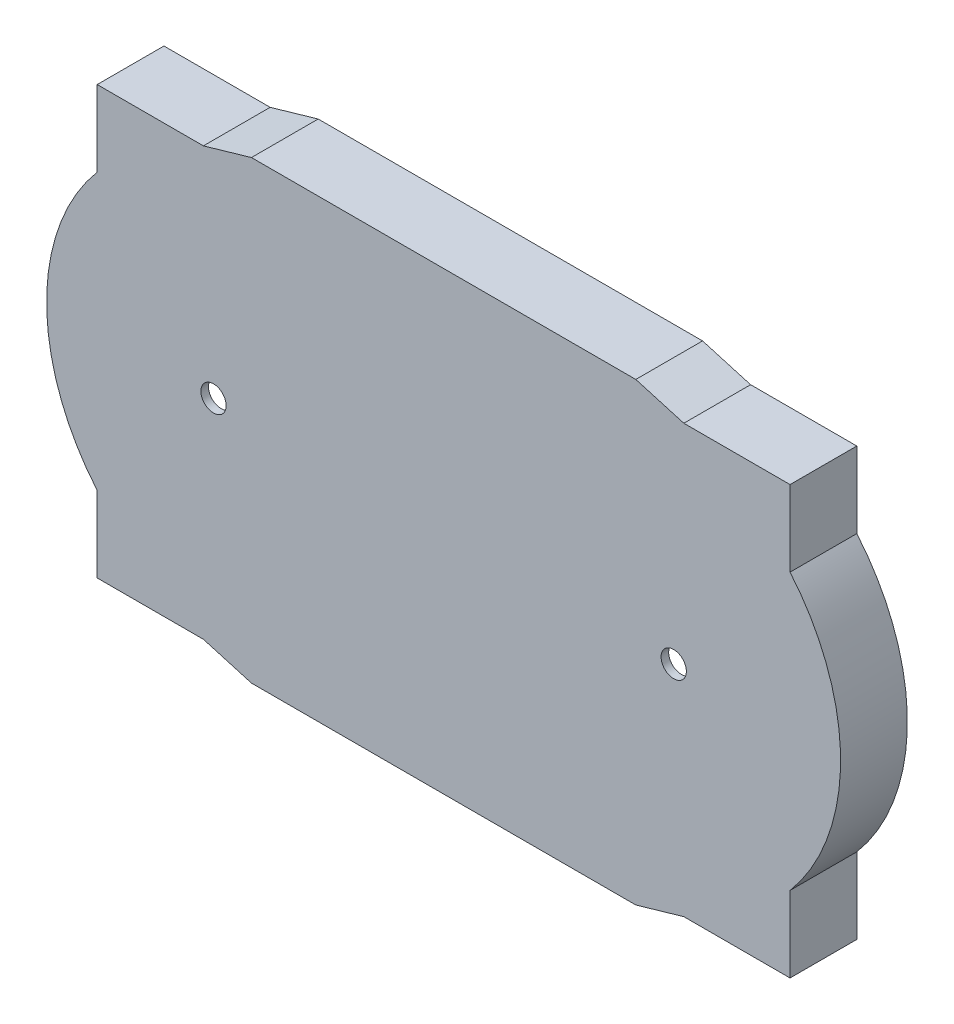
ISO-10303-21;
HEADER;
FILE_DESCRIPTION(('STEP AP214'),'2;1');
FILE_NAME('part.step','',(''),(''),'','','');
FILE_SCHEMA(('AUTOMOTIVE_DESIGN { 1 0 10303 214 1 1 1 1 }'));
ENDSEC;
DATA;
#1=APPLICATION_CONTEXT('core data for automotive mechanical design processes');
#2=APPLICATION_PROTOCOL_DEFINITION('international standard','automotive_design',2000,#1);
#3=PRODUCT_CONTEXT('',#1,'mechanical');
#4=PRODUCT('Part','Part','',(#3));
#5=PRODUCT_RELATED_PRODUCT_CATEGORY('part','',(#4));
#6=PRODUCT_DEFINITION_FORMATION('','',#4);
#7=PRODUCT_DEFINITION_CONTEXT('part definition',#1,'design');
#8=PRODUCT_DEFINITION('design','',#6,#7);
#9=PRODUCT_DEFINITION_SHAPE('','',#8);
#10=(LENGTH_UNIT() NAMED_UNIT(*) SI_UNIT(.MILLI.,.METRE.));
#11=(NAMED_UNIT(*) PLANE_ANGLE_UNIT() SI_UNIT($,.RADIAN.));
#12=(NAMED_UNIT(*) SI_UNIT($,.STERADIAN.) SOLID_ANGLE_UNIT());
#13=UNCERTAINTY_MEASURE_WITH_UNIT(LENGTH_MEASURE(1.E-05),#10,'distance_accuracy_value','');
#14=(GEOMETRIC_REPRESENTATION_CONTEXT(3) GLOBAL_UNCERTAINTY_ASSIGNED_CONTEXT((#13)) GLOBAL_UNIT_ASSIGNED_CONTEXT((#10,
#11,#12)) REPRESENTATION_CONTEXT('',''));
#15=CARTESIAN_POINT('',(0.,0.,0.));
#16=DIRECTION('',(0.,0.,1.));
#17=DIRECTION('',(1.,0.,0.));
#18=AXIS2_PLACEMENT_3D('',#15,#16,#17);
#19=CARTESIAN_POINT('',(0.,0.,0.));
#20=DIRECTION('',(0.,0.,1.));
#21=DIRECTION('',(1.,0.,0.));
#22=AXIS2_PLACEMENT_3D('',#19,#20,#21);
#23=PLANE('',#22);
#24=DIRECTION('',(1.,0.,0.));
#25=VECTOR('',#24,1.);
#26=CARTESIAN_POINT('',(47.5,42.25,0.));
#27=LINE('',#26,#25);
#28=CARTESIAN_POINT('',(47.5,42.25,0.));
#29=VERTEX_POINT('',#28);
#30=CARTESIAN_POINT('',(68.5,42.25,0.));
#31=VERTEX_POINT('',#30);
#32=EDGE_CURVE('E467',#29,#31,#27,.T.);
#33=ORIENTED_EDGE('',*,*,#32,.T.);
#34=DIRECTION('',(0.,-1.,0.));
#35=VECTOR('',#34,1.);
#36=CARTESIAN_POINT('',(68.5,42.25,0.));
#37=LINE('',#36,#35);
#38=CARTESIAN_POINT('',(68.5,27.25,0.));
#39=VERTEX_POINT('',#38);
#40=EDGE_CURVE('E389',#31,#39,#37,.T.);
#41=ORIENTED_EDGE('',*,*,#40,.T.);
#42=CARTESIAN_POINT('',(36.3676618161815,0.,0.));
#43=DIRECTION('',(0.,0.,-1.));
#44=DIRECTION('',(-1.,0.,0.));
#45=AXIS2_PLACEMENT_3D('',#42,#43,#44);
#46=CIRCLE('',#45,42.1313381838184);
#47=CARTESIAN_POINT('',(68.5,-27.25,0.));
#48=VERTEX_POINT('',#47);
#49=EDGE_CURVE('E382',#39,#48,#46,.T.);
#50=ORIENTED_EDGE('',*,*,#49,.T.);
#51=DIRECTION('',(0.,-1.,0.));
#52=VECTOR('',#51,1.);
#53=CARTESIAN_POINT('',(68.5,-42.25,0.));
#54=LINE('',#53,#52);
#55=CARTESIAN_POINT('',(68.5,-42.25,0.));
#56=VERTEX_POINT('',#55);
#57=EDGE_CURVE('E385',#48,#56,#54,.T.);
#58=ORIENTED_EDGE('',*,*,#57,.T.);
#59=DIRECTION('',(-1.,0.,0.));
#60=VECTOR('',#59,1.);
#61=CARTESIAN_POINT('',(47.5,-42.25,0.));
#62=LINE('',#61,#60);
#63=CARTESIAN_POINT('',(47.5,-42.25,0.));
#64=VERTEX_POINT('',#63);
#65=EDGE_CURVE('E448',#56,#64,#62,.T.);
#66=ORIENTED_EDGE('',*,*,#65,.T.);
#67=DIRECTION('',(-0.960564264414561,-0.27805807654106,0.));
#68=VECTOR('',#67,1.);
#69=CARTESIAN_POINT('',(38.,-45.,0.));
#70=LINE('',#69,#68);
#71=CARTESIAN_POINT('',(38.,-45.,0.));
#72=VERTEX_POINT('',#71);
#73=EDGE_CURVE('E450',#64,#72,#70,.T.);
#74=ORIENTED_EDGE('',*,*,#73,.T.);
#75=DIRECTION('',(1.,0.,0.));
#76=VECTOR('',#75,1.);
#77=CARTESIAN_POINT('',(-78.5,-45.,0.));
#78=LINE('',#77,#76);
#79=CARTESIAN_POINT('',(-38.,-45.,0.));
#80=VERTEX_POINT('',#79);
#81=EDGE_CURVE('E493',#80,#72,#78,.T.);
#82=ORIENTED_EDGE('',*,*,#81,.F.);
#83=DIRECTION('',(-0.960564264414561,0.27805807654106,0.));
#84=VECTOR('',#83,1.);
#85=CARTESIAN_POINT('',(-38.,-45.,0.));
#86=LINE('',#85,#84);
#87=CARTESIAN_POINT('',(-47.5,-42.25,0.));
#88=VERTEX_POINT('',#87);
#89=EDGE_CURVE('E432',#80,#88,#86,.T.);
#90=ORIENTED_EDGE('',*,*,#89,.T.);
#91=DIRECTION('',(-1.,0.,0.));
#92=VECTOR('',#91,1.);
#93=CARTESIAN_POINT('',(-47.5,-42.25,0.));
#94=LINE('',#93,#92);
#95=CARTESIAN_POINT('',(-68.5,-42.25,0.));
#96=VERTEX_POINT('',#95);
#97=EDGE_CURVE('E435',#88,#96,#94,.T.);
#98=ORIENTED_EDGE('',*,*,#97,.T.);
#99=DIRECTION('',(0.,1.,0.));
#100=VECTOR('',#99,1.);
#101=CARTESIAN_POINT('',(-68.5,-42.25,0.));
#102=LINE('',#101,#100);
#103=CARTESIAN_POINT('',(-68.5,-27.25,0.));
#104=VERTEX_POINT('',#103);
#105=EDGE_CURVE('E406',#96,#104,#102,.T.);
#106=ORIENTED_EDGE('',*,*,#105,.T.);
#107=CARTESIAN_POINT('',(-36.3676618161815,0.,0.));
#108=DIRECTION('',(0.,0.,-1.));
#109=DIRECTION('',(1.,0.,0.));
#110=AXIS2_PLACEMENT_3D('',#107,#108,#109);
#111=CIRCLE('',#110,42.1313381838184);
#112=CARTESIAN_POINT('',(-68.5,27.25,0.));
#113=VERTEX_POINT('',#112);
#114=EDGE_CURVE('E409',#104,#113,#111,.T.);
#115=ORIENTED_EDGE('',*,*,#114,.T.);
#116=DIRECTION('',(0.,1.,0.));
#117=VECTOR('',#116,1.);
#118=CARTESIAN_POINT('',(-68.5,42.25,0.));
#119=LINE('',#118,#117);
#120=CARTESIAN_POINT('',(-68.5,42.25,0.));
#121=VERTEX_POINT('',#120);
#122=EDGE_CURVE('E413',#113,#121,#119,.T.);
#123=ORIENTED_EDGE('',*,*,#122,.T.);
#124=DIRECTION('',(1.,0.,0.));
#125=VECTOR('',#124,1.);
#126=CARTESIAN_POINT('',(-47.5,42.25,0.));
#127=LINE('',#126,#125);
#128=CARTESIAN_POINT('',(-47.5,42.25,0.));
#129=VERTEX_POINT('',#128);
#130=EDGE_CURVE('E480',#121,#129,#127,.T.);
#131=ORIENTED_EDGE('',*,*,#130,.T.);
#132=DIRECTION('',(0.960564264414561,0.27805807654106,0.));
#133=VECTOR('',#132,1.);
#134=CARTESIAN_POINT('',(-38.,45.,0.));
#135=LINE('',#134,#133);
#136=CARTESIAN_POINT('',(-38.,45.,0.));
#137=VERTEX_POINT('',#136);
#138=EDGE_CURVE('E482',#129,#137,#135,.T.);
#139=ORIENTED_EDGE('',*,*,#138,.T.);
#140=DIRECTION('',(-1.,0.,0.));
#141=VECTOR('',#140,1.);
#142=CARTESIAN_POINT('',(-78.5,45.,0.));
#143=LINE('',#142,#141);
#144=CARTESIAN_POINT('',(38.,45.,0.));
#145=VERTEX_POINT('',#144);
#146=EDGE_CURVE('E496',#145,#137,#143,.T.);
#147=ORIENTED_EDGE('',*,*,#146,.F.);
#148=DIRECTION('',(0.960564264414561,-0.27805807654106,0.));
#149=VECTOR('',#148,1.);
#150=CARTESIAN_POINT('',(38.,45.,0.));
#151=LINE('',#150,#149);
#152=EDGE_CURVE('E464',#145,#29,#151,.T.);
#153=ORIENTED_EDGE('',*,*,#152,.T.);
#154=EDGE_LOOP('',(#33,#41,#50,#58,#66,#74,#82,#90,#98,#106,#115,#123,#131,#139,#147,#153));
#155=FACE_BOUND('',#154,.T.);
#156=DIRECTION('',(1.,0.,0.));
#157=VECTOR('',#156,1.);
#158=CARTESIAN_POINT('',(0.,40.75,0.));
#159=LINE('',#158,#157);
#160=CARTESIAN_POINT('',(47.2872616968584,40.75,0.));
#161=VERTEX_POINT('',#160);
#162=CARTESIAN_POINT('',(67.,40.75,0.));
#163=VERTEX_POINT('',#162);
#164=EDGE_CURVE('E323',#161,#163,#159,.T.);
#165=ORIENTED_EDGE('',*,*,#164,.F.);
#166=DIRECTION('',(0.960564264414561,-0.27805807654106,0.));
#167=VECTOR('',#166,1.);
#168=CARTESIAN_POINT('',(14.5401013835912,50.2294411433143,0.));
#169=LINE('',#168,#167);
#170=CARTESIAN_POINT('',(37.7872616968585,43.5,0.));
#171=VERTEX_POINT('',#170);
#172=EDGE_CURVE('E286',#171,#161,#169,.T.);
#173=ORIENTED_EDGE('',*,*,#172,.F.);
#174=DIRECTION('',(-1.,0.,0.));
#175=VECTOR('',#174,1.);
#176=CARTESIAN_POINT('',(-78.5,43.5,0.));
#177=LINE('',#176,#175);
#178=CARTESIAN_POINT('',(-37.7872616968585,43.5,0.));
#179=VERTEX_POINT('',#178);
#180=EDGE_CURVE('E52',#171,#179,#177,.T.);
#181=ORIENTED_EDGE('',*,*,#180,.T.);
#182=DIRECTION('',(0.960564264414561,0.27805807654106,0.));
#183=VECTOR('',#182,1.);
#184=CARTESIAN_POINT('',(-14.5401013835911,50.2294411433143,0.));
#185=LINE('',#184,#183);
#186=CARTESIAN_POINT('',(-47.2872616968584,40.75,0.));
#187=VERTEX_POINT('',#186);
#188=EDGE_CURVE('E331',#187,#179,#185,.T.);
#189=ORIENTED_EDGE('',*,*,#188,.F.);
#190=DIRECTION('',(1.,0.,0.));
#191=VECTOR('',#190,1.);
#192=CARTESIAN_POINT('',(0.,40.75,0.));
#193=LINE('',#192,#191);
#194=CARTESIAN_POINT('',(-67.,40.75,0.));
#195=VERTEX_POINT('',#194);
#196=EDGE_CURVE('E293',#195,#187,#193,.T.);
#197=ORIENTED_EDGE('',*,*,#196,.F.);
#198=DIRECTION('',(0.,1.,0.));
#199=VECTOR('',#198,1.);
#200=CARTESIAN_POINT('',(-67.,0.,0.));
#201=LINE('',#200,#199);
#202=CARTESIAN_POINT('',(-67.,26.6939225292949,0.));
#203=VERTEX_POINT('',#202);
#204=EDGE_CURVE('E340',#203,#195,#201,.T.);
#205=ORIENTED_EDGE('',*,*,#204,.F.);
#206=CARTESIAN_POINT('',(-36.3676618161815,0.,0.));
#207=DIRECTION('',(0.,0.,1.));
#208=DIRECTION('',(1.,0.,0.));
#209=AXIS2_PLACEMENT_3D('',#206,#207,#208);
#210=CIRCLE('',#209,40.6313381838184);
#211=CARTESIAN_POINT('',(-67.,-26.6939225292949,0.));
#212=VERTEX_POINT('',#211);
#213=EDGE_CURVE('E360',#212,#203,#210,.F.);
#214=ORIENTED_EDGE('',*,*,#213,.F.);
#215=DIRECTION('',(0.,1.,0.));
#216=VECTOR('',#215,1.);
#217=CARTESIAN_POINT('',(-67.,0.,0.));
#218=LINE('',#217,#216);
#219=CARTESIAN_POINT('',(-67.,-40.75,0.));
#220=VERTEX_POINT('',#219);
#221=EDGE_CURVE('E299',#220,#212,#218,.T.);
#222=ORIENTED_EDGE('',*,*,#221,.F.);
#223=DIRECTION('',(-1.,0.,0.));
#224=VECTOR('',#223,1.);
#225=CARTESIAN_POINT('',(0.,-40.75,0.));
#226=LINE('',#225,#224);
#227=CARTESIAN_POINT('',(-47.2872616968584,-40.75,0.));
#228=VERTEX_POINT('',#227);
#229=EDGE_CURVE('E355',#228,#220,#226,.T.);
#230=ORIENTED_EDGE('',*,*,#229,.F.);
#231=DIRECTION('',(-0.960564264414561,0.27805807654106,0.));
#232=VECTOR('',#231,1.);
#233=CARTESIAN_POINT('',(-14.5401013835911,-50.2294411433143,0.));
#234=LINE('',#233,#232);
#235=CARTESIAN_POINT('',(-37.7872616968585,-43.5,0.));
#236=VERTEX_POINT('',#235);
#237=EDGE_CURVE('E310',#236,#228,#234,.T.);
#238=ORIENTED_EDGE('',*,*,#237,.F.);
#239=DIRECTION('',(1.,0.,0.));
#240=VECTOR('',#239,1.);
#241=CARTESIAN_POINT('',(-78.5,-43.5,0.));
#242=LINE('',#241,#240);
#243=CARTESIAN_POINT('',(37.7872616968585,-43.5,0.));
#244=VERTEX_POINT('',#243);
#245=EDGE_CURVE('E327',#236,#244,#242,.T.);
#246=ORIENTED_EDGE('',*,*,#245,.T.);
#247=DIRECTION('',(-0.960564264414561,-0.27805807654106,0.));
#248=VECTOR('',#247,1.);
#249=CARTESIAN_POINT('',(14.5401013835911,-50.2294411433143,0.));
#250=LINE('',#249,#248);
#251=CARTESIAN_POINT('',(47.2872616968584,-40.75,0.));
#252=VERTEX_POINT('',#251);
#253=EDGE_CURVE('E270',#252,#244,#250,.T.);
#254=ORIENTED_EDGE('',*,*,#253,.F.);
#255=DIRECTION('',(-1.,0.,0.));
#256=VECTOR('',#255,1.);
#257=CARTESIAN_POINT('',(0.,-40.75,0.));
#258=LINE('',#257,#256);
#259=CARTESIAN_POINT('',(67.,-40.75,0.));
#260=VERTEX_POINT('',#259);
#261=EDGE_CURVE('E266',#260,#252,#258,.T.);
#262=ORIENTED_EDGE('',*,*,#261,.F.);
#263=DIRECTION('',(0.,-1.,0.));
#264=VECTOR('',#263,1.);
#265=CARTESIAN_POINT('',(67.,0.,0.));
#266=LINE('',#265,#264);
#267=CARTESIAN_POINT('',(67.,-26.6939225292949,0.));
#268=VERTEX_POINT('',#267);
#269=EDGE_CURVE('E375',#268,#260,#266,.T.);
#270=ORIENTED_EDGE('',*,*,#269,.F.);
#271=CARTESIAN_POINT('',(36.3676618161815,0.,0.));
#272=DIRECTION('',(0.,0.,1.));
#273=DIRECTION('',(1.,0.,0.));
#274=AXIS2_PLACEMENT_3D('',#271,#272,#273);
#275=CIRCLE('',#274,40.6313381838184);
#276=CARTESIAN_POINT('',(67.,26.6939225292949,0.));
#277=VERTEX_POINT('',#276);
#278=EDGE_CURVE('E283',#277,#268,#275,.F.);
#279=ORIENTED_EDGE('',*,*,#278,.F.);
#280=DIRECTION('',(0.,-1.,0.));
#281=VECTOR('',#280,1.);
#282=CARTESIAN_POINT('',(67.,0.,0.));
#283=LINE('',#282,#281);
#284=EDGE_CURVE('E349',#163,#277,#283,.T.);
#285=ORIENTED_EDGE('',*,*,#284,.F.);
#286=EDGE_LOOP('',(#165,#173,#181,#189,#197,#205,#214,#222,#230,#238,#246,#254,#262,#270,#279,#285));
#287=FACE_BOUND('',#286,.T.);
#288=ADVANCED_FACE('F35',(#155,#287),#23,.F.);
#289=CARTESIAN_POINT('',(-78.5,-45.,13.2));
#290=DIRECTION('',(0.,1.,0.));
#291=DIRECTION('',(-1.,0.,0.));
#292=AXIS2_PLACEMENT_3D('',#289,#290,#291);
#293=PLANE('',#292);
#294=DIRECTION('',(1.,0.,0.));
#295=VECTOR('',#294,1.);
#296=CARTESIAN_POINT('',(-78.5,-45.,13.2));
#297=LINE('',#296,#295);
#298=CARTESIAN_POINT('',(-38.,-45.,13.2));
#299=VERTEX_POINT('',#298);
#300=CARTESIAN_POINT('',(38.,-45.,13.2));
#301=VERTEX_POINT('',#300);
#302=EDGE_CURVE('E44',#299,#301,#297,.T.);
#303=ORIENTED_EDGE('',*,*,#302,.F.);
#304=DIRECTION('',(0.,0.,1.));
#305=VECTOR('',#304,1.);
#306=CARTESIAN_POINT('',(-38.,-45.,0.));
#307=LINE('',#306,#305);
#308=EDGE_CURVE('E439',#80,#299,#307,.T.);
#309=ORIENTED_EDGE('',*,*,#308,.F.);
#310=ORIENTED_EDGE('',*,*,#81,.T.);
#311=DIRECTION('',(0.,0.,1.));
#312=VECTOR('',#311,1.);
#313=CARTESIAN_POINT('',(38.,-45.,0.));
#314=LINE('',#313,#312);
#315=EDGE_CURVE('E458',#72,#301,#314,.T.);
#316=ORIENTED_EDGE('',*,*,#315,.T.);
#317=EDGE_LOOP('',(#303,#309,#310,#316));
#318=FACE_BOUND('',#317,.T.);
#319=ADVANCED_FACE('F37',(#318),#293,.F.);
#320=CARTESIAN_POINT('',(-78.5,45.,13.2));
#321=DIRECTION('',(0.,-1.,0.));
#322=DIRECTION('',(1.,0.,0.));
#323=AXIS2_PLACEMENT_3D('',#320,#321,#322);
#324=PLANE('',#323);
#325=DIRECTION('',(-1.,0.,0.));
#326=VECTOR('',#325,1.);
#327=CARTESIAN_POINT('',(-78.5,45.,13.2));
#328=LINE('',#327,#326);
#329=CARTESIAN_POINT('',(38.,45.,13.2));
#330=VERTEX_POINT('',#329);
#331=CARTESIAN_POINT('',(-38.,45.,13.2));
#332=VERTEX_POINT('',#331);
#333=EDGE_CURVE('E11',#330,#332,#328,.T.);
#334=ORIENTED_EDGE('',*,*,#333,.F.);
#335=DIRECTION('',(0.,0.,1.));
#336=VECTOR('',#335,1.);
#337=CARTESIAN_POINT('',(38.,45.,0.));
#338=LINE('',#337,#336);
#339=EDGE_CURVE('E471',#145,#330,#338,.T.);
#340=ORIENTED_EDGE('',*,*,#339,.F.);
#341=ORIENTED_EDGE('',*,*,#146,.T.);
#342=DIRECTION('',(0.,0.,1.));
#343=VECTOR('',#342,1.);
#344=CARTESIAN_POINT('',(-38.,45.,0.));
#345=LINE('',#344,#343);
#346=EDGE_CURVE('E490',#137,#332,#345,.T.);
#347=ORIENTED_EDGE('',*,*,#346,.T.);
#348=EDGE_LOOP('',(#334,#340,#341,#347));
#349=FACE_BOUND('',#348,.T.);
#350=ADVANCED_FACE('F540',(#349),#324,.F.);
#351=CARTESIAN_POINT('',(0.,0.,13.2));
#352=DIRECTION('',(0.,0.,1.));
#353=DIRECTION('',(1.,0.,0.));
#354=AXIS2_PLACEMENT_3D('',#351,#352,#353);
#355=PLANE('',#354);
#356=CARTESIAN_POINT('',(-45.5,0.,13.2));
#357=DIRECTION('',(0.,0.,-1.));
#358=DIRECTION('',(1.,0.,0.));
#359=AXIS2_PLACEMENT_3D('',#356,#357,#358);
#360=CIRCLE('',#359,2.5);
#361=CARTESIAN_POINT('',(-43.,0.,13.2));
#362=VERTEX_POINT('',#361);
#363=EDGE_CURVE('E508',#362,#362,#360,.T.);
#364=ORIENTED_EDGE('',*,*,#363,.T.);
#365=EDGE_LOOP('',(#364));
#366=FACE_BOUND('',#365,.T.);
#367=CARTESIAN_POINT('',(45.5,0.,13.2));
#368=DIRECTION('',(0.,0.,-1.));
#369=DIRECTION('',(-1.,0.,0.));
#370=AXIS2_PLACEMENT_3D('',#367,#368,#369);
#371=CIRCLE('',#370,2.5);
#372=CARTESIAN_POINT('',(43.,0.,13.2));
#373=VERTEX_POINT('',#372);
#374=EDGE_CURVE('E500',#373,#373,#371,.T.);
#375=ORIENTED_EDGE('',*,*,#374,.T.);
#376=EDGE_LOOP('',(#375));
#377=FACE_BOUND('',#376,.T.);
#378=DIRECTION('',(0.,-1.,0.));
#379=VECTOR('',#378,1.);
#380=CARTESIAN_POINT('',(68.5,42.25,13.2));
#381=LINE('',#380,#379);
#382=CARTESIAN_POINT('',(68.5,42.25,13.2));
#383=VERTEX_POINT('',#382);
#384=CARTESIAN_POINT('',(68.5,27.25,13.2));
#385=VERTEX_POINT('',#384);
#386=EDGE_CURVE('E386',#383,#385,#381,.T.);
#387=ORIENTED_EDGE('',*,*,#386,.F.);
#388=DIRECTION('',(1.,0.,0.));
#389=VECTOR('',#388,1.);
#390=CARTESIAN_POINT('',(47.5,42.25,13.2));
#391=LINE('',#390,#389);
#392=CARTESIAN_POINT('',(47.5,42.25,13.2));
#393=VERTEX_POINT('',#392);
#394=EDGE_CURVE('E468',#393,#383,#391,.T.);
#395=ORIENTED_EDGE('',*,*,#394,.F.);
#396=DIRECTION('',(0.960564264414561,-0.27805807654106,0.));
#397=VECTOR('',#396,1.);
#398=CARTESIAN_POINT('',(38.,45.,13.2));
#399=LINE('',#398,#397);
#400=EDGE_CURVE('E461',#330,#393,#399,.T.);
#401=ORIENTED_EDGE('',*,*,#400,.F.);
#402=ORIENTED_EDGE('',*,*,#333,.T.);
#403=DIRECTION('',(0.960564264414561,0.27805807654106,0.));
#404=VECTOR('',#403,1.);
#405=CARTESIAN_POINT('',(-38.,45.,13.2));
#406=LINE('',#405,#404);
#407=CARTESIAN_POINT('',(-47.5,42.25,13.2));
#408=VERTEX_POINT('',#407);
#409=EDGE_CURVE('E483',#408,#332,#406,.T.);
#410=ORIENTED_EDGE('',*,*,#409,.F.);
#411=DIRECTION('',(1.,0.,0.));
#412=VECTOR('',#411,1.);
#413=CARTESIAN_POINT('',(-47.5,42.25,13.2));
#414=LINE('',#413,#412);
#415=CARTESIAN_POINT('',(-68.5,42.25,13.2));
#416=VERTEX_POINT('',#415);
#417=EDGE_CURVE('E478',#416,#408,#414,.T.);
#418=ORIENTED_EDGE('',*,*,#417,.F.);
#419=DIRECTION('',(0.,1.,0.));
#420=VECTOR('',#419,1.);
#421=CARTESIAN_POINT('',(-68.5,42.25,13.2));
#422=LINE('',#421,#420);
#423=CARTESIAN_POINT('',(-68.5,27.25,13.2));
#424=VERTEX_POINT('',#423);
#425=EDGE_CURVE('E410',#424,#416,#422,.T.);
#426=ORIENTED_EDGE('',*,*,#425,.F.);
#427=CARTESIAN_POINT('',(-36.3676618161815,0.,13.2));
#428=DIRECTION('',(0.,0.,-1.));
#429=DIRECTION('',(1.,0.,0.));
#430=AXIS2_PLACEMENT_3D('',#427,#428,#429);
#431=CIRCLE('',#430,42.1313381838184);
#432=CARTESIAN_POINT('',(-68.5,-27.25,13.2));
#433=VERTEX_POINT('',#432);
#434=EDGE_CURVE('E419',#433,#424,#431,.T.);
#435=ORIENTED_EDGE('',*,*,#434,.F.);
#436=DIRECTION('',(0.,1.,0.));
#437=VECTOR('',#436,1.);
#438=CARTESIAN_POINT('',(-68.5,-42.25,13.2));
#439=LINE('',#438,#437);
#440=CARTESIAN_POINT('',(-68.5,-42.25,13.2));
#441=VERTEX_POINT('',#440);
#442=EDGE_CURVE('E400',#441,#433,#439,.T.);
#443=ORIENTED_EDGE('',*,*,#442,.F.);
#444=DIRECTION('',(-1.,0.,0.));
#445=VECTOR('',#444,1.);
#446=CARTESIAN_POINT('',(-47.5,-42.25,13.2));
#447=LINE('',#446,#445);
#448=CARTESIAN_POINT('',(-47.5,-42.25,13.2));
#449=VERTEX_POINT('',#448);
#450=EDGE_CURVE('E436',#449,#441,#447,.T.);
#451=ORIENTED_EDGE('',*,*,#450,.F.);
#452=DIRECTION('',(-0.960564264414561,0.27805807654106,0.));
#453=VECTOR('',#452,1.);
#454=CARTESIAN_POINT('',(-38.,-45.,13.2));
#455=LINE('',#454,#453);
#456=EDGE_CURVE('E426',#299,#449,#455,.T.);
#457=ORIENTED_EDGE('',*,*,#456,.F.);
#458=ORIENTED_EDGE('',*,*,#302,.T.);
#459=DIRECTION('',(-0.960564264414561,-0.27805807654106,0.));
#460=VECTOR('',#459,1.);
#461=CARTESIAN_POINT('',(38.,-45.,13.2));
#462=LINE('',#461,#460);
#463=CARTESIAN_POINT('',(47.5,-42.25,13.2));
#464=VERTEX_POINT('',#463);
#465=EDGE_CURVE('E451',#464,#301,#462,.T.);
#466=ORIENTED_EDGE('',*,*,#465,.F.);
#467=DIRECTION('',(-1.,0.,0.));
#468=VECTOR('',#467,1.);
#469=CARTESIAN_POINT('',(47.5,-42.25,13.2));
#470=LINE('',#469,#468);
#471=CARTESIAN_POINT('',(68.5,-42.25,13.2));
#472=VERTEX_POINT('',#471);
#473=EDGE_CURVE('E446',#472,#464,#470,.T.);
#474=ORIENTED_EDGE('',*,*,#473,.F.);
#475=DIRECTION('',(0.,-1.,0.));
#476=VECTOR('',#475,1.);
#477=CARTESIAN_POINT('',(68.5,-42.25,13.2));
#478=LINE('',#477,#476);
#479=CARTESIAN_POINT('',(68.5,-27.25,13.2));
#480=VERTEX_POINT('',#479);
#481=EDGE_CURVE('E60',#480,#472,#478,.T.);
#482=ORIENTED_EDGE('',*,*,#481,.F.);
#483=CARTESIAN_POINT('',(36.3676618161815,0.,13.2));
#484=DIRECTION('',(0.,0.,-1.));
#485=DIRECTION('',(-1.,0.,0.));
#486=AXIS2_PLACEMENT_3D('',#483,#484,#485);
#487=CIRCLE('',#486,42.1313381838184);
#488=EDGE_CURVE('E289',#385,#480,#487,.T.);
#489=ORIENTED_EDGE('',*,*,#488,.F.);
#490=EDGE_LOOP('',(#387,#395,#401,#402,#410,#418,#426,#435,#443,#451,#457,#458,#466,#474,#482,#489));
#491=FACE_BOUND('',#490,.T.);
#492=ADVANCED_FACE('F513',(#366,#377,#491),#355,.T.);
#493=CARTESIAN_POINT('',(-38.,45.,0.));
#494=DIRECTION('',(0.27805807654106,-0.960564264414561,0.));
#495=DIRECTION('',(0.960564264414561,0.27805807654106,0.));
#496=AXIS2_PLACEMENT_3D('',#493,#494,#495);
#497=PLANE('',#496);
#498=ORIENTED_EDGE('',*,*,#409,.T.);
#499=ORIENTED_EDGE('',*,*,#346,.F.);
#500=ORIENTED_EDGE('',*,*,#138,.F.);
#501=DIRECTION('',(0.,0.,1.));
#502=VECTOR('',#501,1.);
#503=CARTESIAN_POINT('',(-47.5,42.25,0.));
#504=LINE('',#503,#502);
#505=EDGE_CURVE('E486',#129,#408,#504,.T.);
#506=ORIENTED_EDGE('',*,*,#505,.T.);
#507=EDGE_LOOP('',(#498,#499,#500,#506));
#508=FACE_BOUND('',#507,.T.);
#509=ADVANCED_FACE('F550',(#508),#497,.F.);
#510=CARTESIAN_POINT('',(-47.5,42.25,0.));
#511=DIRECTION('',(0.,-1.,0.));
#512=DIRECTION('',(1.,0.,0.));
#513=AXIS2_PLACEMENT_3D('',#510,#511,#512);
#514=PLANE('',#513);
#515=ORIENTED_EDGE('',*,*,#130,.F.);
#516=DIRECTION('',(0.,0.,1.));
#517=VECTOR('',#516,1.);
#518=CARTESIAN_POINT('',(-68.5,42.25,0.));
#519=LINE('',#518,#517);
#520=EDGE_CURVE('E423',#121,#416,#519,.T.);
#521=ORIENTED_EDGE('',*,*,#520,.T.);
#522=ORIENTED_EDGE('',*,*,#417,.T.);
#523=ORIENTED_EDGE('',*,*,#505,.F.);
#524=EDGE_LOOP('',(#515,#521,#522,#523));
#525=FACE_BOUND('',#524,.T.);
#526=ADVANCED_FACE('F566',(#525),#514,.F.);
#527=CARTESIAN_POINT('',(47.5,42.25,0.));
#528=DIRECTION('',(0.,-1.,0.));
#529=DIRECTION('',(1.,0.,0.));
#530=AXIS2_PLACEMENT_3D('',#527,#528,#529);
#531=PLANE('',#530);
#532=ORIENTED_EDGE('',*,*,#394,.T.);
#533=DIRECTION('',(0.,0.,1.));
#534=VECTOR('',#533,1.);
#535=CARTESIAN_POINT('',(68.5,42.25,0.));
#536=LINE('',#535,#534);
#537=EDGE_CURVE('E401',#31,#383,#536,.T.);
#538=ORIENTED_EDGE('',*,*,#537,.F.);
#539=ORIENTED_EDGE('',*,*,#32,.F.);
#540=DIRECTION('',(0.,0.,1.));
#541=VECTOR('',#540,1.);
#542=CARTESIAN_POINT('',(47.5,42.25,0.));
#543=LINE('',#542,#541);
#544=EDGE_CURVE('E476',#29,#393,#543,.T.);
#545=ORIENTED_EDGE('',*,*,#544,.T.);
#546=EDGE_LOOP('',(#532,#538,#539,#545));
#547=FACE_BOUND('',#546,.T.);
#548=ADVANCED_FACE('F608',(#547),#531,.F.);
#549=CARTESIAN_POINT('',(38.,45.,0.));
#550=DIRECTION('',(-0.27805807654106,-0.960564264414561,0.));
#551=DIRECTION('',(0.960564264414561,-0.27805807654106,0.));
#552=AXIS2_PLACEMENT_3D('',#549,#550,#551);
#553=PLANE('',#552);
#554=ORIENTED_EDGE('',*,*,#400,.T.);
#555=ORIENTED_EDGE('',*,*,#544,.F.);
#556=ORIENTED_EDGE('',*,*,#152,.F.);
#557=ORIENTED_EDGE('',*,*,#339,.T.);
#558=EDGE_LOOP('',(#554,#555,#556,#557));
#559=FACE_BOUND('',#558,.T.);
#560=ADVANCED_FACE('F611',(#559),#553,.F.);
#561=CARTESIAN_POINT('',(38.,-45.,0.));
#562=DIRECTION('',(-0.27805807654106,0.960564264414561,0.));
#563=DIRECTION('',(-0.960564264414561,-0.27805807654106,0.));
#564=AXIS2_PLACEMENT_3D('',#561,#562,#563);
#565=PLANE('',#564);
#566=ORIENTED_EDGE('',*,*,#465,.T.);
#567=ORIENTED_EDGE('',*,*,#315,.F.);
#568=ORIENTED_EDGE('',*,*,#73,.F.);
#569=DIRECTION('',(0.,0.,1.));
#570=VECTOR('',#569,1.);
#571=CARTESIAN_POINT('',(47.5,-42.25,0.));
#572=LINE('',#571,#570);
#573=EDGE_CURVE('E454',#64,#464,#572,.T.);
#574=ORIENTED_EDGE('',*,*,#573,.T.);
#575=EDGE_LOOP('',(#566,#567,#568,#574));
#576=FACE_BOUND('',#575,.T.);
#577=ADVANCED_FACE('F593',(#576),#565,.F.);
#578=CARTESIAN_POINT('',(47.5,-42.25,0.));
#579=DIRECTION('',(0.,1.,0.));
#580=DIRECTION('',(-1.,0.,0.));
#581=AXIS2_PLACEMENT_3D('',#578,#579,#580);
#582=PLANE('',#581);
#583=ORIENTED_EDGE('',*,*,#65,.F.);
#584=DIRECTION('',(0.,0.,1.));
#585=VECTOR('',#584,1.);
#586=CARTESIAN_POINT('',(68.5,-42.25,0.));
#587=LINE('',#586,#585);
#588=EDGE_CURVE('E403',#56,#472,#587,.T.);
#589=ORIENTED_EDGE('',*,*,#588,.T.);
#590=ORIENTED_EDGE('',*,*,#473,.T.);
#591=ORIENTED_EDGE('',*,*,#573,.F.);
#592=EDGE_LOOP('',(#583,#589,#590,#591));
#593=FACE_BOUND('',#592,.T.);
#594=ADVANCED_FACE('F598',(#593),#582,.F.);
#595=CARTESIAN_POINT('',(-47.5,-42.25,0.));
#596=DIRECTION('',(0.,1.,0.));
#597=DIRECTION('',(-1.,0.,0.));
#598=AXIS2_PLACEMENT_3D('',#595,#596,#597);
#599=PLANE('',#598);
#600=ORIENTED_EDGE('',*,*,#450,.T.);
#601=DIRECTION('',(0.,0.,1.));
#602=VECTOR('',#601,1.);
#603=CARTESIAN_POINT('',(-68.5,-42.25,0.));
#604=LINE('',#603,#602);
#605=EDGE_CURVE('E416',#96,#441,#604,.T.);
#606=ORIENTED_EDGE('',*,*,#605,.F.);
#607=ORIENTED_EDGE('',*,*,#97,.F.);
#608=DIRECTION('',(0.,0.,1.));
#609=VECTOR('',#608,1.);
#610=CARTESIAN_POINT('',(-47.5,-42.25,0.));
#611=LINE('',#610,#609);
#612=EDGE_CURVE('E444',#88,#449,#611,.T.);
#613=ORIENTED_EDGE('',*,*,#612,.T.);
#614=EDGE_LOOP('',(#600,#606,#607,#613));
#615=FACE_BOUND('',#614,.T.);
#616=ADVANCED_FACE('F582',(#615),#599,.F.);
#617=CARTESIAN_POINT('',(-38.,-45.,0.));
#618=DIRECTION('',(0.27805807654106,0.960564264414561,0.));
#619=DIRECTION('',(-0.960564264414561,0.27805807654106,0.));
#620=AXIS2_PLACEMENT_3D('',#617,#618,#619);
#621=PLANE('',#620);
#622=ORIENTED_EDGE('',*,*,#456,.T.);
#623=ORIENTED_EDGE('',*,*,#612,.F.);
#624=ORIENTED_EDGE('',*,*,#89,.F.);
#625=ORIENTED_EDGE('',*,*,#308,.T.);
#626=EDGE_LOOP('',(#622,#623,#624,#625));
#627=FACE_BOUND('',#626,.T.);
#628=ADVANCED_FACE('F585',(#627),#621,.F.);
#629=CARTESIAN_POINT('',(-68.5,42.25,0.));
#630=DIRECTION('',(1.,0.,0.));
#631=DIRECTION('',(0.,0.,-1.));
#632=AXIS2_PLACEMENT_3D('',#629,#630,#631);
#633=PLANE('',#632);
#634=ORIENTED_EDGE('',*,*,#425,.T.);
#635=ORIENTED_EDGE('',*,*,#520,.F.);
#636=ORIENTED_EDGE('',*,*,#122,.F.);
#637=DIRECTION('',(0.,0.,1.));
#638=VECTOR('',#637,1.);
#639=CARTESIAN_POINT('',(-68.5,27.25,0.));
#640=LINE('',#639,#638);
#641=EDGE_CURVE('E427',#113,#424,#640,.T.);
#642=ORIENTED_EDGE('',*,*,#641,.T.);
#643=EDGE_LOOP('',(#634,#635,#636,#642));
#644=FACE_BOUND('',#643,.T.);
#645=ADVANCED_FACE('F571',(#644),#633,.F.);
#646=CARTESIAN_POINT('',(-36.3676618161815,0.,0.));
#647=DIRECTION('',(0.,0.,1.));
#648=DIRECTION('',(1.,0.,0.));
#649=AXIS2_PLACEMENT_3D('',#646,#647,#648);
#650=CYLINDRICAL_SURFACE('',#649,42.1313381838184);
#651=ORIENTED_EDGE('',*,*,#434,.T.);
#652=ORIENTED_EDGE('',*,*,#641,.F.);
#653=ORIENTED_EDGE('',*,*,#114,.F.);
#654=DIRECTION('',(0.,0.,1.));
#655=VECTOR('',#654,1.);
#656=CARTESIAN_POINT('',(-68.5,-27.25,0.));
#657=LINE('',#656,#655);
#658=EDGE_CURVE('E429',#104,#433,#657,.T.);
#659=ORIENTED_EDGE('',*,*,#658,.T.);
#660=EDGE_LOOP('',(#651,#652,#653,#659));
#661=FACE_BOUND('',#660,.T.);
#662=ADVANCED_FACE('F575',(#661),#650,.T.);
#663=CARTESIAN_POINT('',(-68.5,-42.25,0.));
#664=DIRECTION('',(1.,0.,0.));
#665=DIRECTION('',(0.,0.,-1.));
#666=AXIS2_PLACEMENT_3D('',#663,#664,#665);
#667=PLANE('',#666);
#668=ORIENTED_EDGE('',*,*,#442,.T.);
#669=ORIENTED_EDGE('',*,*,#658,.F.);
#670=ORIENTED_EDGE('',*,*,#105,.F.);
#671=ORIENTED_EDGE('',*,*,#605,.T.);
#672=EDGE_LOOP('',(#668,#669,#670,#671));
#673=FACE_BOUND('',#672,.T.);
#674=ADVANCED_FACE('F577',(#673),#667,.F.);
#675=CARTESIAN_POINT('',(36.3676618161815,0.,0.));
#676=DIRECTION('',(0.,0.,1.));
#677=DIRECTION('',(1.,0.,0.));
#678=AXIS2_PLACEMENT_3D('',#675,#676,#677);
#679=CYLINDRICAL_SURFACE('',#678,42.1313381838184);
#680=ORIENTED_EDGE('',*,*,#488,.T.);
#681=DIRECTION('',(0.,0.,1.));
#682=VECTOR('',#681,1.);
#683=CARTESIAN_POINT('',(68.5,-27.25,0.));
#684=LINE('',#683,#682);
#685=EDGE_CURVE('E392',#48,#480,#684,.T.);
#686=ORIENTED_EDGE('',*,*,#685,.F.);
#687=ORIENTED_EDGE('',*,*,#49,.F.);
#688=DIRECTION('',(0.,0.,1.));
#689=VECTOR('',#688,1.);
#690=CARTESIAN_POINT('',(68.5,27.25,0.));
#691=LINE('',#690,#689);
#692=EDGE_CURVE('E398',#39,#385,#691,.T.);
#693=ORIENTED_EDGE('',*,*,#692,.T.);
#694=EDGE_LOOP('',(#680,#686,#687,#693));
#695=FACE_BOUND('',#694,.T.);
#696=ADVANCED_FACE('F602',(#695),#679,.T.);
#697=CARTESIAN_POINT('',(68.5,42.25,0.));
#698=DIRECTION('',(-1.,0.,0.));
#699=DIRECTION('',(0.,0.,1.));
#700=AXIS2_PLACEMENT_3D('',#697,#698,#699);
#701=PLANE('',#700);
#702=ORIENTED_EDGE('',*,*,#386,.T.);
#703=ORIENTED_EDGE('',*,*,#692,.F.);
#704=ORIENTED_EDGE('',*,*,#40,.F.);
#705=ORIENTED_EDGE('',*,*,#537,.T.);
#706=EDGE_LOOP('',(#702,#703,#704,#705));
#707=FACE_BOUND('',#706,.T.);
#708=ADVANCED_FACE('F605',(#707),#701,.F.);
#709=CARTESIAN_POINT('',(68.5,-42.25,0.));
#710=DIRECTION('',(-1.,0.,0.));
#711=DIRECTION('',(0.,0.,1.));
#712=AXIS2_PLACEMENT_3D('',#709,#710,#711);
#713=PLANE('',#712);
#714=ORIENTED_EDGE('',*,*,#481,.T.);
#715=ORIENTED_EDGE('',*,*,#588,.F.);
#716=ORIENTED_EDGE('',*,*,#57,.F.);
#717=ORIENTED_EDGE('',*,*,#685,.T.);
#718=EDGE_LOOP('',(#714,#715,#716,#717));
#719=FACE_BOUND('',#718,.T.);
#720=ADVANCED_FACE('F693',(#719),#713,.F.);
#721=CARTESIAN_POINT('',(-78.5,-43.5,13.2));
#722=DIRECTION('',(0.,1.,0.));
#723=DIRECTION('',(-1.,0.,0.));
#724=AXIS2_PLACEMENT_3D('',#721,#722,#723);
#725=PLANE('',#724);
#726=DIRECTION('',(1.,0.,0.));
#727=VECTOR('',#726,1.);
#728=CARTESIAN_POINT('',(-78.5,-43.5,11.7));
#729=LINE('',#728,#727);
#730=CARTESIAN_POINT('',(-37.7872616968585,-43.5,11.7));
#731=VERTEX_POINT('',#730);
#732=CARTESIAN_POINT('',(37.7872616968585,-43.5,11.7));
#733=VERTEX_POINT('',#732);
#734=EDGE_CURVE('E244',#731,#733,#729,.T.);
#735=ORIENTED_EDGE('',*,*,#734,.T.);
#736=DIRECTION('',(0.,0.,1.));
#737=VECTOR('',#736,1.);
#738=CARTESIAN_POINT('',(37.7872616968585,-43.5,13.2));
#739=LINE('',#738,#737);
#740=EDGE_CURVE('E249',#244,#733,#739,.T.);
#741=ORIENTED_EDGE('',*,*,#740,.F.);
#742=ORIENTED_EDGE('',*,*,#245,.F.);
#743=DIRECTION('',(0.,0.,1.));
#744=VECTOR('',#743,1.);
#745=CARTESIAN_POINT('',(-37.7872616968585,-43.5,0.));
#746=LINE('',#745,#744);
#747=EDGE_CURVE('E251',#236,#731,#746,.T.);
#748=ORIENTED_EDGE('',*,*,#747,.T.);
#749=EDGE_LOOP('',(#735,#741,#742,#748));
#750=FACE_BOUND('',#749,.T.);
#751=ADVANCED_FACE('F246',(#750),#725,.T.);
#752=CARTESIAN_POINT('',(-78.5,43.5,13.2));
#753=DIRECTION('',(0.,-1.,0.));
#754=DIRECTION('',(1.,0.,0.));
#755=AXIS2_PLACEMENT_3D('',#752,#753,#754);
#756=PLANE('',#755);
#757=DIRECTION('',(-1.,0.,0.));
#758=VECTOR('',#757,1.);
#759=CARTESIAN_POINT('',(-78.5,43.5,11.7));
#760=LINE('',#759,#758);
#761=CARTESIAN_POINT('',(37.7872616968585,43.5,11.7));
#762=VERTEX_POINT('',#761);
#763=CARTESIAN_POINT('',(-37.7872616968585,43.5,11.7));
#764=VERTEX_POINT('',#763);
#765=EDGE_CURVE('E255',#762,#764,#760,.T.);
#766=ORIENTED_EDGE('',*,*,#765,.T.);
#767=DIRECTION('',(0.,0.,1.));
#768=VECTOR('',#767,1.);
#769=CARTESIAN_POINT('',(-37.7872616968585,43.5,13.2));
#770=LINE('',#769,#768);
#771=EDGE_CURVE('E324',#179,#764,#770,.T.);
#772=ORIENTED_EDGE('',*,*,#771,.F.);
#773=ORIENTED_EDGE('',*,*,#180,.F.);
#774=DIRECTION('',(0.,0.,1.));
#775=VECTOR('',#774,1.);
#776=CARTESIAN_POINT('',(37.7872616968585,43.5,0.));
#777=LINE('',#776,#775);
#778=EDGE_CURVE('E321',#171,#762,#777,.T.);
#779=ORIENTED_EDGE('',*,*,#778,.T.);
#780=EDGE_LOOP('',(#766,#772,#773,#779));
#781=FACE_BOUND('',#780,.T.);
#782=ADVANCED_FACE('F524',(#781),#756,.T.);
#783=CARTESIAN_POINT('',(0.,0.,11.7));
#784=DIRECTION('',(0.,0.,1.));
#785=DIRECTION('',(1.,0.,0.));
#786=AXIS2_PLACEMENT_3D('',#783,#784,#785);
#787=PLANE('',#786);
#788=CARTESIAN_POINT('',(-45.5,0.,11.7));
#789=DIRECTION('',(0.,0.,1.));
#790=DIRECTION('',(1.,0.,0.));
#791=AXIS2_PLACEMENT_3D('',#788,#789,#790);
#792=CIRCLE('',#791,2.5);
#793=CARTESIAN_POINT('',(-43.,0.,11.7));
#794=VERTEX_POINT('',#793);
#795=EDGE_CURVE('E39',#794,#794,#792,.T.);
#796=ORIENTED_EDGE('',*,*,#795,.T.);
#797=EDGE_LOOP('',(#796));
#798=FACE_BOUND('',#797,.T.);
#799=CARTESIAN_POINT('',(45.5,0.,11.7));
#800=DIRECTION('',(0.,0.,1.));
#801=DIRECTION('',(1.,0.,0.));
#802=AXIS2_PLACEMENT_3D('',#799,#800,#801);
#803=CIRCLE('',#802,2.5);
#804=CARTESIAN_POINT('',(48.,0.,11.7));
#805=VERTEX_POINT('',#804);
#806=EDGE_CURVE('E320',#805,#805,#803,.T.);
#807=ORIENTED_EDGE('',*,*,#806,.T.);
#808=EDGE_LOOP('',(#807));
#809=FACE_BOUND('',#808,.T.);
#810=DIRECTION('',(0.,-1.,0.));
#811=VECTOR('',#810,1.);
#812=CARTESIAN_POINT('',(67.,0.,11.7));
#813=LINE('',#812,#811);
#814=CARTESIAN_POINT('',(67.,40.75,11.7));
#815=VERTEX_POINT('',#814);
#816=CARTESIAN_POINT('',(67.,26.6939225292949,11.7));
#817=VERTEX_POINT('',#816);
#818=EDGE_CURVE('E281',#815,#817,#813,.T.);
#819=ORIENTED_EDGE('',*,*,#818,.T.);
#820=CARTESIAN_POINT('',(36.3676618161815,0.,11.7));
#821=DIRECTION('',(0.,0.,1.));
#822=DIRECTION('',(1.,0.,0.));
#823=AXIS2_PLACEMENT_3D('',#820,#821,#822);
#824=CIRCLE('',#823,40.6313381838184);
#825=CARTESIAN_POINT('',(67.,-26.6939225292949,11.7));
#826=VERTEX_POINT('',#825);
#827=EDGE_CURVE('E317',#817,#826,#824,.F.);
#828=ORIENTED_EDGE('',*,*,#827,.T.);
#829=DIRECTION('',(0.,-1.,0.));
#830=VECTOR('',#829,1.);
#831=CARTESIAN_POINT('',(67.,0.,11.7));
#832=LINE('',#831,#830);
#833=CARTESIAN_POINT('',(67.,-40.75,11.7));
#834=VERTEX_POINT('',#833);
#835=EDGE_CURVE('E284',#826,#834,#832,.T.);
#836=ORIENTED_EDGE('',*,*,#835,.T.);
#837=DIRECTION('',(-1.,0.,0.));
#838=VECTOR('',#837,1.);
#839=CARTESIAN_POINT('',(0.,-40.75,11.7));
#840=LINE('',#839,#838);
#841=CARTESIAN_POINT('',(47.2872616968584,-40.75,11.7));
#842=VERTEX_POINT('',#841);
#843=EDGE_CURVE('E262',#834,#842,#840,.T.);
#844=ORIENTED_EDGE('',*,*,#843,.T.);
#845=DIRECTION('',(-0.960564264414561,-0.27805807654106,0.));
#846=VECTOR('',#845,1.);
#847=CARTESIAN_POINT('',(14.5401013835911,-50.2294411433143,11.7));
#848=LINE('',#847,#846);
#849=EDGE_CURVE('E258',#842,#733,#848,.T.);
#850=ORIENTED_EDGE('',*,*,#849,.T.);
#851=ORIENTED_EDGE('',*,*,#734,.F.);
#852=DIRECTION('',(-0.960564264414561,0.27805807654106,0.));
#853=VECTOR('',#852,1.);
#854=CARTESIAN_POINT('',(-14.5401013835911,-50.2294411433143,11.7));
#855=LINE('',#854,#853);
#856=CARTESIAN_POINT('',(-47.2872616968584,-40.75,11.7));
#857=VERTEX_POINT('',#856);
#858=EDGE_CURVE('E311',#731,#857,#855,.T.);
#859=ORIENTED_EDGE('',*,*,#858,.T.);
#860=DIRECTION('',(-1.,0.,0.));
#861=VECTOR('',#860,1.);
#862=CARTESIAN_POINT('',(0.,-40.75,11.7));
#863=LINE('',#862,#861);
#864=CARTESIAN_POINT('',(-67.,-40.75,11.7));
#865=VERTEX_POINT('',#864);
#866=EDGE_CURVE('E307',#857,#865,#863,.T.);
#867=ORIENTED_EDGE('',*,*,#866,.T.);
#868=DIRECTION('',(0.,1.,0.));
#869=VECTOR('',#868,1.);
#870=CARTESIAN_POINT('',(-67.,0.,11.7));
#871=LINE('',#870,#869);
#872=CARTESIAN_POINT('',(-67.,-26.6939225292949,11.7));
#873=VERTEX_POINT('',#872);
#874=EDGE_CURVE('E303',#865,#873,#871,.T.);
#875=ORIENTED_EDGE('',*,*,#874,.T.);
#876=CARTESIAN_POINT('',(-36.3676618161815,0.,11.7));
#877=DIRECTION('',(0.,0.,1.));
#878=DIRECTION('',(1.,0.,0.));
#879=AXIS2_PLACEMENT_3D('',#876,#877,#878);
#880=CIRCLE('',#879,40.6313381838184);
#881=CARTESIAN_POINT('',(-67.,26.6939225292949,11.7));
#882=VERTEX_POINT('',#881);
#883=EDGE_CURVE('E300',#873,#882,#880,.F.);
#884=ORIENTED_EDGE('',*,*,#883,.T.);
#885=DIRECTION('',(0.,1.,0.));
#886=VECTOR('',#885,1.);
#887=CARTESIAN_POINT('',(-67.,0.,11.7));
#888=LINE('',#887,#886);
#889=CARTESIAN_POINT('',(-67.,40.75,11.7));
#890=VERTEX_POINT('',#889);
#891=EDGE_CURVE('E297',#882,#890,#888,.T.);
#892=ORIENTED_EDGE('',*,*,#891,.T.);
#893=DIRECTION('',(1.,0.,0.));
#894=VECTOR('',#893,1.);
#895=CARTESIAN_POINT('',(0.,40.75,11.7));
#896=LINE('',#895,#894);
#897=CARTESIAN_POINT('',(-47.2872616968584,40.75,11.7));
#898=VERTEX_POINT('',#897);
#899=EDGE_CURVE('E294',#890,#898,#896,.T.);
#900=ORIENTED_EDGE('',*,*,#899,.T.);
#901=DIRECTION('',(0.960564264414561,0.27805807654106,0.));
#902=VECTOR('',#901,1.);
#903=CARTESIAN_POINT('',(-14.5401013835911,50.2294411433143,11.7));
#904=LINE('',#903,#902);
#905=EDGE_CURVE('E290',#898,#764,#904,.T.);
#906=ORIENTED_EDGE('',*,*,#905,.T.);
#907=ORIENTED_EDGE('',*,*,#765,.F.);
#908=DIRECTION('',(0.960564264414561,-0.27805807654106,0.));
#909=VECTOR('',#908,1.);
#910=CARTESIAN_POINT('',(14.5401013835912,50.2294411433143,11.7));
#911=LINE('',#910,#909);
#912=CARTESIAN_POINT('',(47.2872616968584,40.75,11.7));
#913=VERTEX_POINT('',#912);
#914=EDGE_CURVE('E272',#762,#913,#911,.T.);
#915=ORIENTED_EDGE('',*,*,#914,.T.);
#916=DIRECTION('',(1.,0.,0.));
#917=VECTOR('',#916,1.);
#918=CARTESIAN_POINT('',(0.,40.75,11.7));
#919=LINE('',#918,#917);
#920=EDGE_CURVE('E276',#913,#815,#919,.T.);
#921=ORIENTED_EDGE('',*,*,#920,.T.);
#922=EDGE_LOOP('',(#819,#828,#836,#844,#850,#851,#859,#867,#875,#884,#892,#900,#906,#907,#915,#921));
#923=FACE_BOUND('',#922,.T.);
#924=ADVANCED_FACE('F260',(#798,#809,#923),#787,.F.);
#925=CARTESIAN_POINT('',(-37.5829128851884,43.5591536033782,0.));
#926=DIRECTION('',(0.27805807654106,-0.960564264414561,0.));
#927=DIRECTION('',(0.960564264414561,0.27805807654106,0.));
#928=AXIS2_PLACEMENT_3D('',#925,#926,#927);
#929=PLANE('',#928);
#930=ORIENTED_EDGE('',*,*,#905,.F.);
#931=DIRECTION('',(0.,0.,1.));
#932=VECTOR('',#931,1.);
#933=CARTESIAN_POINT('',(-47.2872616968584,40.75,0.));
#934=LINE('',#933,#932);
#935=EDGE_CURVE('E328',#187,#898,#934,.T.);
#936=ORIENTED_EDGE('',*,*,#935,.F.);
#937=ORIENTED_EDGE('',*,*,#188,.T.);
#938=ORIENTED_EDGE('',*,*,#771,.T.);
#939=EDGE_LOOP('',(#930,#936,#937,#938));
#940=FACE_BOUND('',#939,.T.);
#941=ADVANCED_FACE('F523',(#940),#929,.T.);
#942=CARTESIAN_POINT('',(-47.5,40.75,0.));
#943=DIRECTION('',(0.,-1.,0.));
#944=DIRECTION('',(1.,0.,0.));
#945=AXIS2_PLACEMENT_3D('',#942,#943,#944);
#946=PLANE('',#945);
#947=ORIENTED_EDGE('',*,*,#196,.T.);
#948=ORIENTED_EDGE('',*,*,#935,.T.);
#949=ORIENTED_EDGE('',*,*,#899,.F.);
#950=DIRECTION('',(0.,0.,1.));
#951=VECTOR('',#950,1.);
#952=CARTESIAN_POINT('',(-67.,40.75,0.));
#953=LINE('',#952,#951);
#954=EDGE_CURVE('E312',#195,#890,#953,.T.);
#955=ORIENTED_EDGE('',*,*,#954,.F.);
#956=EDGE_LOOP('',(#947,#948,#949,#955));
#957=FACE_BOUND('',#956,.T.);
#958=ADVANCED_FACE('F530',(#957),#946,.T.);
#959=CARTESIAN_POINT('',(47.5,40.75,0.));
#960=DIRECTION('',(0.,-1.,0.));
#961=DIRECTION('',(1.,0.,0.));
#962=AXIS2_PLACEMENT_3D('',#959,#960,#961);
#963=PLANE('',#962);
#964=ORIENTED_EDGE('',*,*,#920,.F.);
#965=DIRECTION('',(0.,0.,1.));
#966=VECTOR('',#965,1.);
#967=CARTESIAN_POINT('',(47.2872616968584,40.75,0.));
#968=LINE('',#967,#966);
#969=EDGE_CURVE('E296',#161,#913,#968,.T.);
#970=ORIENTED_EDGE('',*,*,#969,.F.);
#971=ORIENTED_EDGE('',*,*,#164,.T.);
#972=DIRECTION('',(0.,0.,1.));
#973=VECTOR('',#972,1.);
#974=CARTESIAN_POINT('',(67.,40.75,0.));
#975=LINE('',#974,#973);
#976=EDGE_CURVE('E343',#163,#815,#975,.T.);
#977=ORIENTED_EDGE('',*,*,#976,.T.);
#978=EDGE_LOOP('',(#964,#970,#971,#977));
#979=FACE_BOUND('',#978,.T.);
#980=ADVANCED_FACE('F735',(#979),#963,.T.);
#981=CARTESIAN_POINT('',(37.5829128851884,43.5591536033782,0.));
#982=DIRECTION('',(-0.27805807654106,-0.960564264414561,0.));
#983=DIRECTION('',(0.960564264414561,-0.27805807654106,0.));
#984=AXIS2_PLACEMENT_3D('',#981,#982,#983);
#985=PLANE('',#984);
#986=ORIENTED_EDGE('',*,*,#914,.F.);
#987=ORIENTED_EDGE('',*,*,#778,.F.);
#988=ORIENTED_EDGE('',*,*,#172,.T.);
#989=ORIENTED_EDGE('',*,*,#969,.T.);
#990=EDGE_LOOP('',(#986,#987,#988,#989));
#991=FACE_BOUND('',#990,.T.);
#992=ADVANCED_FACE('F745',(#991),#985,.T.);
#993=CARTESIAN_POINT('',(37.5829128851884,-43.5591536033782,0.));
#994=DIRECTION('',(-0.27805807654106,0.960564264414561,0.));
#995=DIRECTION('',(-0.960564264414561,-0.27805807654106,0.));
#996=AXIS2_PLACEMENT_3D('',#993,#994,#995);
#997=PLANE('',#996);
#998=ORIENTED_EDGE('',*,*,#849,.F.);
#999=DIRECTION('',(0.,0.,1.));
#1000=VECTOR('',#999,1.);
#1001=CARTESIAN_POINT('',(47.2872616968584,-40.75,0.));
#1002=LINE('',#1001,#1000);
#1003=EDGE_CURVE('E273',#252,#842,#1002,.T.);
#1004=ORIENTED_EDGE('',*,*,#1003,.F.);
#1005=ORIENTED_EDGE('',*,*,#253,.T.);
#1006=ORIENTED_EDGE('',*,*,#740,.T.);
#1007=EDGE_LOOP('',(#998,#1004,#1005,#1006));
#1008=FACE_BOUND('',#1007,.T.);
#1009=ADVANCED_FACE('F268',(#1008),#997,.T.);
#1010=CARTESIAN_POINT('',(47.5,-40.75,0.));
#1011=DIRECTION('',(0.,1.,0.));
#1012=DIRECTION('',(-1.,0.,0.));
#1013=AXIS2_PLACEMENT_3D('',#1010,#1011,#1012);
#1014=PLANE('',#1013);
#1015=ORIENTED_EDGE('',*,*,#261,.T.);
#1016=ORIENTED_EDGE('',*,*,#1003,.T.);
#1017=ORIENTED_EDGE('',*,*,#843,.F.);
#1018=DIRECTION('',(0.,0.,1.));
#1019=VECTOR('',#1018,1.);
#1020=CARTESIAN_POINT('',(67.,-40.75,0.));
#1021=LINE('',#1020,#1019);
#1022=EDGE_CURVE('E345',#260,#834,#1021,.T.);
#1023=ORIENTED_EDGE('',*,*,#1022,.F.);
#1024=EDGE_LOOP('',(#1015,#1016,#1017,#1023));
#1025=FACE_BOUND('',#1024,.T.);
#1026=ADVANCED_FACE('F764',(#1025),#1014,.T.);
#1027=CARTESIAN_POINT('',(-47.5,-40.75,0.));
#1028=DIRECTION('',(0.,1.,0.));
#1029=DIRECTION('',(-1.,0.,0.));
#1030=AXIS2_PLACEMENT_3D('',#1027,#1028,#1029);
#1031=PLANE('',#1030);
#1032=ORIENTED_EDGE('',*,*,#866,.F.);
#1033=DIRECTION('',(0.,0.,1.));
#1034=VECTOR('',#1033,1.);
#1035=CARTESIAN_POINT('',(-47.2872616968584,-40.75,0.));
#1036=LINE('',#1035,#1034);
#1037=EDGE_CURVE('E315',#228,#857,#1036,.T.);
#1038=ORIENTED_EDGE('',*,*,#1037,.F.);
#1039=ORIENTED_EDGE('',*,*,#229,.T.);
#1040=DIRECTION('',(0.,0.,1.));
#1041=VECTOR('',#1040,1.);
#1042=CARTESIAN_POINT('',(-67.,-40.75,0.));
#1043=LINE('',#1042,#1041);
#1044=EDGE_CURVE('E338',#220,#865,#1043,.T.);
#1045=ORIENTED_EDGE('',*,*,#1044,.T.);
#1046=EDGE_LOOP('',(#1032,#1038,#1039,#1045));
#1047=FACE_BOUND('',#1046,.T.);
#1048=ADVANCED_FACE('F773',(#1047),#1031,.T.);
#1049=CARTESIAN_POINT('',(-37.5829128851884,-43.5591536033782,0.));
#1050=DIRECTION('',(0.27805807654106,0.960564264414561,0.));
#1051=DIRECTION('',(-0.960564264414561,0.27805807654106,0.));
#1052=AXIS2_PLACEMENT_3D('',#1049,#1050,#1051);
#1053=PLANE('',#1052);
#1054=ORIENTED_EDGE('',*,*,#858,.F.);
#1055=ORIENTED_EDGE('',*,*,#747,.F.);
#1056=ORIENTED_EDGE('',*,*,#237,.T.);
#1057=ORIENTED_EDGE('',*,*,#1037,.T.);
#1058=EDGE_LOOP('',(#1054,#1055,#1056,#1057));
#1059=FACE_BOUND('',#1058,.T.);
#1060=ADVANCED_FACE('F783',(#1059),#1053,.T.);
#1061=CARTESIAN_POINT('',(-67.,42.25,0.));
#1062=DIRECTION('',(1.,0.,0.));
#1063=DIRECTION('',(0.,0.,-1.));
#1064=AXIS2_PLACEMENT_3D('',#1061,#1062,#1063);
#1065=PLANE('',#1064);
#1066=ORIENTED_EDGE('',*,*,#891,.F.);
#1067=DIRECTION('',(0.,0.,1.));
#1068=VECTOR('',#1067,1.);
#1069=CARTESIAN_POINT('',(-67.,26.6939225292949,0.));
#1070=LINE('',#1069,#1068);
#1071=EDGE_CURVE('E334',#203,#882,#1070,.T.);
#1072=ORIENTED_EDGE('',*,*,#1071,.F.);
#1073=ORIENTED_EDGE('',*,*,#204,.T.);
#1074=ORIENTED_EDGE('',*,*,#954,.T.);
#1075=EDGE_LOOP('',(#1066,#1072,#1073,#1074));
#1076=FACE_BOUND('',#1075,.T.);
#1077=ADVANCED_FACE('F793',(#1076),#1065,.T.);
#1078=CARTESIAN_POINT('',(-36.3676618161815,0.,0.));
#1079=DIRECTION('',(0.,0.,1.));
#1080=DIRECTION('',(1.,0.,0.));
#1081=AXIS2_PLACEMENT_3D('',#1078,#1079,#1080);
#1082=CYLINDRICAL_SURFACE('',#1081,40.6313381838184);
#1083=ORIENTED_EDGE('',*,*,#883,.F.);
#1084=DIRECTION('',(0.,0.,1.));
#1085=VECTOR('',#1084,1.);
#1086=CARTESIAN_POINT('',(-67.,-26.6939225292949,0.));
#1087=LINE('',#1086,#1085);
#1088=EDGE_CURVE('E336',#212,#873,#1087,.T.);
#1089=ORIENTED_EDGE('',*,*,#1088,.F.);
#1090=ORIENTED_EDGE('',*,*,#213,.T.);
#1091=ORIENTED_EDGE('',*,*,#1071,.T.);
#1092=EDGE_LOOP('',(#1083,#1089,#1090,#1091));
#1093=FACE_BOUND('',#1092,.T.);
#1094=ADVANCED_FACE('F803',(#1093),#1082,.F.);
#1095=CARTESIAN_POINT('',(-67.,-42.25,0.));
#1096=DIRECTION('',(1.,0.,0.));
#1097=DIRECTION('',(0.,0.,-1.));
#1098=AXIS2_PLACEMENT_3D('',#1095,#1096,#1097);
#1099=PLANE('',#1098);
#1100=ORIENTED_EDGE('',*,*,#874,.F.);
#1101=ORIENTED_EDGE('',*,*,#1044,.F.);
#1102=ORIENTED_EDGE('',*,*,#221,.T.);
#1103=ORIENTED_EDGE('',*,*,#1088,.T.);
#1104=EDGE_LOOP('',(#1100,#1101,#1102,#1103));
#1105=FACE_BOUND('',#1104,.T.);
#1106=ADVANCED_FACE('F813',(#1105),#1099,.T.);
#1107=CARTESIAN_POINT('',(36.3676618161815,0.,0.));
#1108=DIRECTION('',(0.,0.,1.));
#1109=DIRECTION('',(1.,0.,0.));
#1110=AXIS2_PLACEMENT_3D('',#1107,#1108,#1109);
#1111=CYLINDRICAL_SURFACE('',#1110,40.6313381838184);
#1112=ORIENTED_EDGE('',*,*,#827,.F.);
#1113=DIRECTION('',(0.,0.,1.));
#1114=VECTOR('',#1113,1.);
#1115=CARTESIAN_POINT('',(67.,26.6939225292949,0.));
#1116=LINE('',#1115,#1114);
#1117=EDGE_CURVE('E306',#277,#817,#1116,.T.);
#1118=ORIENTED_EDGE('',*,*,#1117,.F.);
#1119=ORIENTED_EDGE('',*,*,#278,.T.);
#1120=DIRECTION('',(0.,0.,1.));
#1121=VECTOR('',#1120,1.);
#1122=CARTESIAN_POINT('',(67.,-26.6939225292949,0.));
#1123=LINE('',#1122,#1121);
#1124=EDGE_CURVE('E347',#268,#826,#1123,.T.);
#1125=ORIENTED_EDGE('',*,*,#1124,.T.);
#1126=EDGE_LOOP('',(#1112,#1118,#1119,#1125));
#1127=FACE_BOUND('',#1126,.T.);
#1128=ADVANCED_FACE('F823',(#1127),#1111,.F.);
#1129=CARTESIAN_POINT('',(67.,42.25,0.));
#1130=DIRECTION('',(-1.,0.,0.));
#1131=DIRECTION('',(0.,0.,1.));
#1132=AXIS2_PLACEMENT_3D('',#1129,#1130,#1131);
#1133=PLANE('',#1132);
#1134=ORIENTED_EDGE('',*,*,#818,.F.);
#1135=ORIENTED_EDGE('',*,*,#976,.F.);
#1136=ORIENTED_EDGE('',*,*,#284,.T.);
#1137=ORIENTED_EDGE('',*,*,#1117,.T.);
#1138=EDGE_LOOP('',(#1134,#1135,#1136,#1137));
#1139=FACE_BOUND('',#1138,.T.);
#1140=ADVANCED_FACE('F833',(#1139),#1133,.T.);
#1141=CARTESIAN_POINT('',(67.,-42.25,0.));
#1142=DIRECTION('',(-1.,0.,0.));
#1143=DIRECTION('',(0.,0.,1.));
#1144=AXIS2_PLACEMENT_3D('',#1141,#1142,#1143);
#1145=PLANE('',#1144);
#1146=ORIENTED_EDGE('',*,*,#835,.F.);
#1147=ORIENTED_EDGE('',*,*,#1124,.F.);
#1148=ORIENTED_EDGE('',*,*,#269,.T.);
#1149=ORIENTED_EDGE('',*,*,#1022,.T.);
#1150=EDGE_LOOP('',(#1146,#1147,#1148,#1149));
#1151=FACE_BOUND('',#1150,.T.);
#1152=ADVANCED_FACE('F843',(#1151),#1145,.T.);
#1153=CARTESIAN_POINT('',(45.5,0.,13.2));
#1154=DIRECTION('',(0.,0.,-1.));
#1155=DIRECTION('',(-1.,0.,0.));
#1156=AXIS2_PLACEMENT_3D('',#1153,#1154,#1155);
#1157=CYLINDRICAL_SURFACE('',#1156,2.5);
#1158=ORIENTED_EDGE('',*,*,#374,.F.);
#1159=EDGE_LOOP('',(#1158));
#1160=FACE_BOUND('',#1159,.T.);
#1161=ORIENTED_EDGE('',*,*,#806,.F.);
#1162=EDGE_LOOP('',(#1161));
#1163=FACE_BOUND('',#1162,.T.);
#1164=ADVANCED_FACE('F518',(#1160,#1163),#1157,.F.);
#1165=CARTESIAN_POINT('',(-45.5,0.,13.2));
#1166=DIRECTION('',(0.,0.,-1.));
#1167=DIRECTION('',(-1.,0.,0.));
#1168=AXIS2_PLACEMENT_3D('',#1165,#1166,#1167);
#1169=CYLINDRICAL_SURFACE('',#1168,2.5);
#1170=ORIENTED_EDGE('',*,*,#363,.F.);
#1171=EDGE_LOOP('',(#1170));
#1172=FACE_BOUND('',#1171,.T.);
#1173=ORIENTED_EDGE('',*,*,#795,.F.);
#1174=EDGE_LOOP('',(#1173));
#1175=FACE_BOUND('',#1174,.T.);
#1176=ADVANCED_FACE('F515',(#1172,#1175),#1169,.F.);
#1177=CLOSED_SHELL('',(#288,#319,#350,#492,#509,#526,#548,#560,#577,#594,#616,#628,#645,#662,
#674,#696,#708,#720,#751,#782,#924,#941,#958,#980,#992,#1009,#1026,#1048,#1060,#1077,#1094,
#1106,#1128,#1140,#1152,#1164,#1176));
#1178=MANIFOLD_SOLID_BREP('B2',#1177);
#1179=ADVANCED_BREP_SHAPE_REPRESENTATION('',(#18,#1178),#14);
#1180=SHAPE_DEFINITION_REPRESENTATION(#9,#1179);
ENDSEC;
END-ISO-10303-21;
